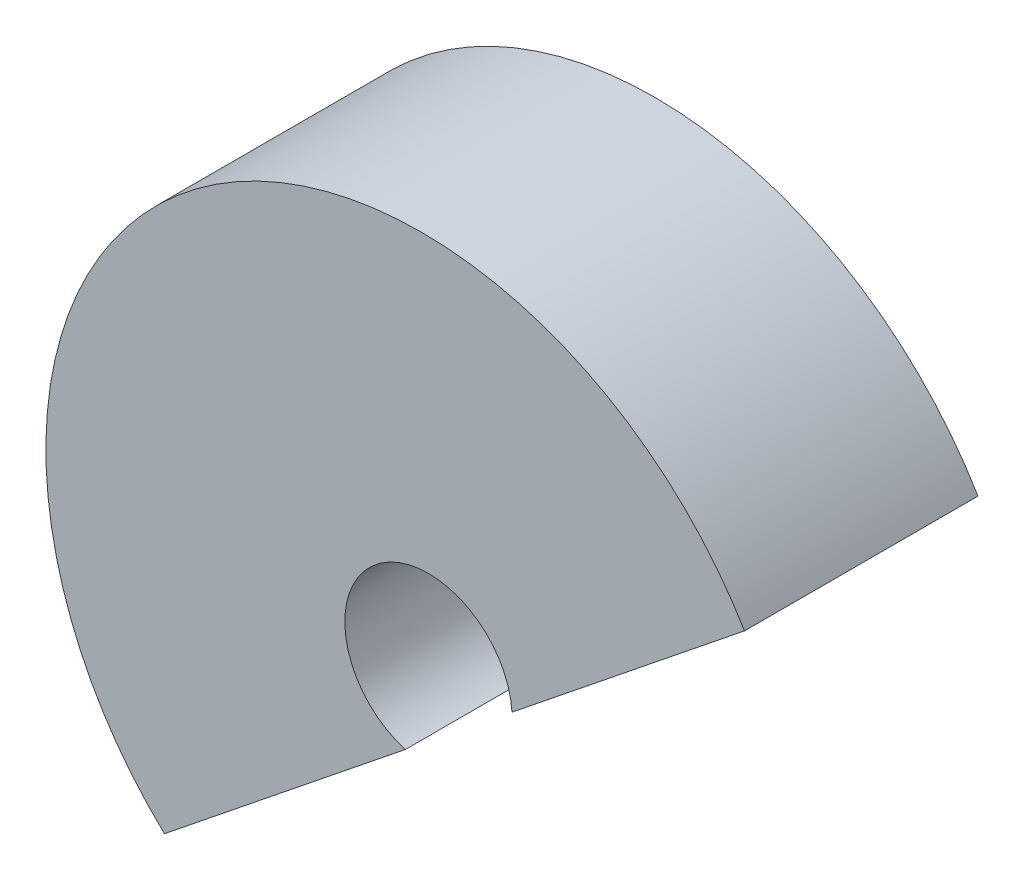
ISO-10303-21;
HEADER;
FILE_DESCRIPTION(('STEP AP214'),'2;1');
FILE_NAME('part.step','',(''),(''),'','','');
FILE_SCHEMA(('AUTOMOTIVE_DESIGN { 1 0 10303 214 1 1 1 1 }'));
ENDSEC;
DATA;
#1=APPLICATION_CONTEXT('core data for automotive mechanical design processes');
#2=APPLICATION_PROTOCOL_DEFINITION('international standard','automotive_design',2000,#1);
#3=PRODUCT_CONTEXT('',#1,'mechanical');
#4=PRODUCT('Part','Part','',(#3));
#5=PRODUCT_RELATED_PRODUCT_CATEGORY('part','',(#4));
#6=PRODUCT_DEFINITION_FORMATION('','',#4);
#7=PRODUCT_DEFINITION_CONTEXT('part definition',#1,'design');
#8=PRODUCT_DEFINITION('design','',#6,#7);
#9=PRODUCT_DEFINITION_SHAPE('','',#8);
#10=(LENGTH_UNIT() NAMED_UNIT(*) SI_UNIT(.MILLI.,.METRE.));
#11=(NAMED_UNIT(*) PLANE_ANGLE_UNIT() SI_UNIT($,.RADIAN.));
#12=(NAMED_UNIT(*) SI_UNIT($,.STERADIAN.) SOLID_ANGLE_UNIT());
#13=UNCERTAINTY_MEASURE_WITH_UNIT(LENGTH_MEASURE(1.E-05),#10,'distance_accuracy_value','');
#14=(GEOMETRIC_REPRESENTATION_CONTEXT(3) GLOBAL_UNCERTAINTY_ASSIGNED_CONTEXT((#13)) GLOBAL_UNIT_ASSIGNED_CONTEXT((#10,
#11,#12)) REPRESENTATION_CONTEXT('',''));
#15=CARTESIAN_POINT('',(0.,0.,0.));
#16=DIRECTION('',(0.,0.,1.));
#17=DIRECTION('',(1.,0.,0.));
#18=AXIS2_PLACEMENT_3D('',#15,#16,#17);
#19=CARTESIAN_POINT('',(-96.9189802867384,0.,40.));
#20=DIRECTION('',(0.,0.,-1.));
#21=DIRECTION('',(-1.,0.,0.));
#22=AXIS2_PLACEMENT_3D('',#19,#20,#21);
#23=CYLINDRICAL_SURFACE('',#22,64.3454131682351);
#24=DIRECTION('',(0.,0.,-1.));
#25=VECTOR('',#24,1.);
#26=CARTESIAN_POINT('',(-140.961454091346,-46.9104753435875,40.));
#27=LINE('',#26,#25);
#28=CARTESIAN_POINT('',(-140.961454091346,-46.9104753435875,40.));
#29=VERTEX_POINT('',#28);
#30=CARTESIAN_POINT('',(-140.961454091346,-46.9104753435875,0.));
#31=VERTEX_POINT('',#30);
#32=EDGE_CURVE('E47',#29,#31,#27,.T.);
#33=ORIENTED_EDGE('',*,*,#32,.F.);
#34=CARTESIAN_POINT('',(-96.9189802867384,0.,40.));
#35=DIRECTION('',(0.,0.,1.));
#36=DIRECTION('',(1.,0.,0.));
#37=AXIS2_PLACEMENT_3D('',#34,#35,#36);
#38=CIRCLE('',#37,64.3454131682351);
#39=CARTESIAN_POINT('',(-41.5972070070214,32.8608216114337,40.));
#40=VERTEX_POINT('',#39);
#41=EDGE_CURVE('E101',#40,#29,#38,.T.);
#42=ORIENTED_EDGE('',*,*,#41,.F.);
#43=DIRECTION('',(0.,0.,-1.));
#44=VECTOR('',#43,1.);
#45=CARTESIAN_POINT('',(-41.5972070070214,32.8608216114337,40.));
#46=LINE('',#45,#44);
#47=CARTESIAN_POINT('',(-41.5972070070214,32.8608216114337,0.));
#48=VERTEX_POINT('',#47);
#49=EDGE_CURVE('E93',#48,#40,#46,.F.);
#50=ORIENTED_EDGE('',*,*,#49,.F.);
#51=CARTESIAN_POINT('',(-96.9189802867384,0.,0.));
#52=DIRECTION('',(0.,0.,1.));
#53=DIRECTION('',(1.,0.,0.));
#54=AXIS2_PLACEMENT_3D('',#51,#52,#53);
#55=CIRCLE('',#54,64.3454131682351);
#56=EDGE_CURVE('E80',#48,#31,#55,.T.);
#57=ORIENTED_EDGE('',*,*,#56,.T.);
#58=EDGE_LOOP('',(#33,#42,#50,#57));
#59=FACE_BOUND('',#58,.T.);
#60=ADVANCED_FACE('F33',(#59),#23,.T.);
#61=CARTESIAN_POINT('',(-96.9189802867384,0.,40.));
#62=DIRECTION('',(0.,0.,1.));
#63=DIRECTION('',(1.,0.,0.));
#64=AXIS2_PLACEMENT_3D('',#61,#62,#63);
#65=PLANE('',#64);
#66=ORIENTED_EDGE('',*,*,#41,.T.);
#67=DIRECTION('',(-0.779796144218473,-0.626033524231732,0.));
#68=VECTOR('',#67,1.);
#69=CARTESIAN_POINT('',(-21.1169908875075,49.3026852566772,40.));
#70=LINE('',#69,#68);
#71=CARTESIAN_POINT('',(-99.6866626051321,-13.7743751363454,40.));
#72=VERTEX_POINT('',#71);
#73=EDGE_CURVE('E89',#72,#29,#70,.T.);
#74=ORIENTED_EDGE('',*,*,#73,.F.);
#75=CARTESIAN_POINT('',(-95.7293153524927,0.,40.));
#76=DIRECTION('',(0.,0.,1.));
#77=DIRECTION('',(1.,0.,0.));
#78=AXIS2_PLACEMENT_3D('',#75,#76,#77);
#79=CIRCLE('',#78,14.3315738031363);
#80=CARTESIAN_POINT('',(-81.4251707650006,0.886259157844655,40.));
#81=VERTEX_POINT('',#80);
#82=EDGE_CURVE('E81',#81,#72,#79,.T.);
#83=ORIENTED_EDGE('',*,*,#82,.F.);
#84=EDGE_CURVE('E54',#40,#81,#70,.T.);
#85=ORIENTED_EDGE('',*,*,#84,.F.);
#86=EDGE_LOOP('',(#66,#74,#83,#85));
#87=FACE_BOUND('',#86,.T.);
#88=ADVANCED_FACE('F128',(#87),#65,.T.);
#89=CARTESIAN_POINT('',(-95.7293153524927,0.,0.));
#90=DIRECTION('',(0.,0.,1.));
#91=DIRECTION('',(1.,0.,0.));
#92=AXIS2_PLACEMENT_3D('',#89,#90,#91);
#93=CYLINDRICAL_SURFACE('',#92,14.3315738031363);
#94=DIRECTION('',(0.,0.,1.));
#95=VECTOR('',#94,1.);
#96=CARTESIAN_POINT('',(-81.4251707650006,0.886259157844655,0.));
#97=LINE('',#96,#95);
#98=CARTESIAN_POINT('',(-81.4251707650006,0.886259157844659,0.));
#99=VERTEX_POINT('',#98);
#100=EDGE_CURVE('E11',#81,#99,#97,.F.);
#101=ORIENTED_EDGE('',*,*,#100,.F.);
#102=ORIENTED_EDGE('',*,*,#82,.T.);
#103=DIRECTION('',(0.,0.,1.));
#104=VECTOR('',#103,1.);
#105=CARTESIAN_POINT('',(-99.6866626051321,-13.7743751363454,0.));
#106=LINE('',#105,#104);
#107=CARTESIAN_POINT('',(-99.6866626051321,-13.7743751363454,0.));
#108=VERTEX_POINT('',#107);
#109=EDGE_CURVE('E40',#108,#72,#106,.T.);
#110=ORIENTED_EDGE('',*,*,#109,.F.);
#111=CARTESIAN_POINT('',(-95.7293153524927,0.,0.));
#112=DIRECTION('',(0.,0.,1.));
#113=DIRECTION('',(1.,0.,0.));
#114=AXIS2_PLACEMENT_3D('',#111,#112,#113);
#115=CIRCLE('',#114,14.3315738031363);
#116=EDGE_CURVE('E74',#99,#108,#115,.T.);
#117=ORIENTED_EDGE('',*,*,#116,.F.);
#118=EDGE_LOOP('',(#101,#102,#110,#117));
#119=FACE_BOUND('',#118,.T.);
#120=ADVANCED_FACE('F76',(#119),#93,.F.);
#121=CARTESIAN_POINT('',(-96.9189802867384,0.,0.));
#122=DIRECTION('',(0.,0.,1.));
#123=DIRECTION('',(1.,0.,0.));
#124=AXIS2_PLACEMENT_3D('',#121,#122,#123);
#125=PLANE('',#124);
#126=ORIENTED_EDGE('',*,*,#56,.F.);
#127=DIRECTION('',(-0.779796144218473,-0.626033524231732,0.));
#128=VECTOR('',#127,1.);
#129=CARTESIAN_POINT('',(-21.1169908875075,49.3026852566772,0.));
#130=LINE('',#129,#128);
#131=EDGE_CURVE('E85',#48,#99,#130,.T.);
#132=ORIENTED_EDGE('',*,*,#131,.T.);
#133=ORIENTED_EDGE('',*,*,#116,.T.);
#134=EDGE_CURVE('E90',#108,#31,#130,.T.);
#135=ORIENTED_EDGE('',*,*,#134,.T.);
#136=EDGE_LOOP('',(#126,#132,#133,#135));
#137=FACE_BOUND('',#136,.T.);
#138=ADVANCED_FACE('F86',(#137),#125,.F.);
#139=CARTESIAN_POINT('',(-21.1169908875075,49.3026852566772,272.925207840169));
#140=DIRECTION('',(0.626033524231732,-0.779796144218473,0.));
#141=DIRECTION('',(0.779796144218473,0.626033524231732,0.));
#142=AXIS2_PLACEMENT_3D('',#139,#140,#141);
#143=PLANE('',#142);
#144=ORIENTED_EDGE('',*,*,#73,.T.);
#145=ORIENTED_EDGE('',*,*,#32,.T.);
#146=ORIENTED_EDGE('',*,*,#134,.F.);
#147=ORIENTED_EDGE('',*,*,#109,.T.);
#148=EDGE_LOOP('',(#144,#145,#146,#147));
#149=FACE_BOUND('',#148,.T.);
#150=ADVANCED_FACE('F104',(#149),#143,.T.);
#151=CARTESIAN_POINT('',(-58.9299725490859,18.9457844861142,19.9000690249989));
#152=DIRECTION('',(0.626033524231732,-0.779796144218473,0.));
#153=DIRECTION('',(0.779796144218473,0.626033524231732,0.));
#154=AXIS2_PLACEMENT_3D('',#151,#152,#153);
#155=CIRCLE('',#154,17.7920905321757);
#156=CARTESIAN_POINT('',(-45.0557689545093,30.0842296254222,19.9000690249989));
#157=VERTEX_POINT('',#156);
#158=EDGE_CURVE('E108',#157,#157,#155,.T.);
#159=ORIENTED_EDGE('',*,*,#158,.F.);
#160=EDGE_LOOP('',(#159));
#161=FACE_BOUND('',#160,.T.);
#162=ORIENTED_EDGE('',*,*,#131,.F.);
#163=ORIENTED_EDGE('',*,*,#49,.T.);
#164=ORIENTED_EDGE('',*,*,#84,.T.);
#165=ORIENTED_EDGE('',*,*,#100,.T.);
#166=EDGE_LOOP('',(#162,#163,#164,#165));
#167=FACE_BOUND('',#166,.T.);
#168=ADVANCED_FACE('F92',(#161,#167),#143,.T.);
#169=CARTESIAN_POINT('',(-70.198575985257,32.9821150820467,19.9000690249989));
#170=DIRECTION('',(0.626033524231732,-0.779796144218473,0.));
#171=DIRECTION('',(0.779796144218473,0.626033524231732,0.));
#172=AXIS2_PLACEMENT_3D('',#169,#170,#171);
#173=CYLINDRICAL_SURFACE('',#172,17.7920905321757);
#174=CARTESIAN_POINT('',(-70.198575985257,32.9821150820467,19.9000690249989));
#175=DIRECTION('',(0.626033524231732,-0.779796144218473,0.));
#176=DIRECTION('',(0.779796144218473,0.626033524231732,0.));
#177=AXIS2_PLACEMENT_3D('',#174,#175,#176);
#178=CIRCLE('',#177,17.7920905321757);
#179=CARTESIAN_POINT('',(-56.3243723906805,44.1205602213547,19.9000690249989));
#180=VERTEX_POINT('',#179);
#181=EDGE_CURVE('E106',#180,#180,#178,.T.);
#182=ORIENTED_EDGE('',*,*,#181,.F.);
#183=EDGE_LOOP('',(#182));
#184=FACE_BOUND('',#183,.T.);
#185=ORIENTED_EDGE('',*,*,#158,.T.);
#186=EDGE_LOOP('',(#185));
#187=FACE_BOUND('',#186,.T.);
#188=ADVANCED_FACE('F115',(#184,#187),#173,.F.);
#189=CARTESIAN_POINT('',(-70.198575985257,32.9821150820467,19.9000690249989));
#190=DIRECTION('',(0.626033524231732,-0.779796144218473,0.));
#191=DIRECTION('',(0.779796144218473,0.626033524231732,0.));
#192=AXIS2_PLACEMENT_3D('',#189,#190,#191);
#193=PLANE('',#192);
#194=ORIENTED_EDGE('',*,*,#181,.T.);
#195=EDGE_LOOP('',(#194));
#196=FACE_BOUND('',#195,.T.);
#197=ADVANCED_FACE('F123',(#196),#193,.T.);
#198=CLOSED_SHELL('',(#60,#88,#120,#138,#150,#168,#188,#197));
#199=MANIFOLD_SOLID_BREP('B2',#198);
#200=ADVANCED_BREP_SHAPE_REPRESENTATION('',(#18,#199),#14);
#201=SHAPE_DEFINITION_REPRESENTATION(#9,#200);
ENDSEC;
END-ISO-10303-21;
